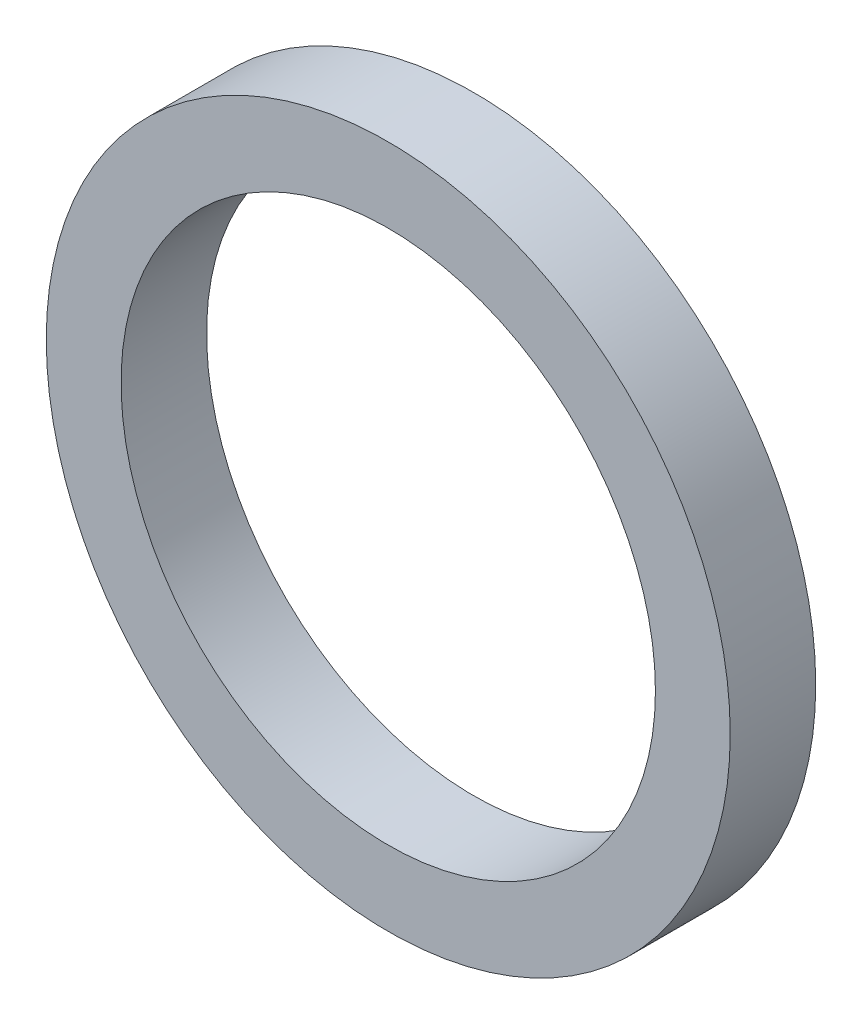
ISO-10303-21;
HEADER;
FILE_DESCRIPTION(('STEP AP214'),'2;1');
FILE_NAME('part.step','',(''),(''),'','','');
FILE_SCHEMA(('AUTOMOTIVE_DESIGN { 1 0 10303 214 1 1 1 1 }'));
ENDSEC;
DATA;
#1=APPLICATION_CONTEXT('core data for automotive mechanical design processes');
#2=APPLICATION_PROTOCOL_DEFINITION('international standard','automotive_design',2000,#1);
#3=PRODUCT_CONTEXT('',#1,'mechanical');
#4=PRODUCT('Part','Part','',(#3));
#5=PRODUCT_RELATED_PRODUCT_CATEGORY('part','',(#4));
#6=PRODUCT_DEFINITION_FORMATION('','',#4);
#7=PRODUCT_DEFINITION_CONTEXT('part definition',#1,'design');
#8=PRODUCT_DEFINITION('design','',#6,#7);
#9=PRODUCT_DEFINITION_SHAPE('','',#8);
#10=(LENGTH_UNIT() NAMED_UNIT(*) SI_UNIT(.MILLI.,.METRE.));
#11=(NAMED_UNIT(*) PLANE_ANGLE_UNIT() SI_UNIT($,.RADIAN.));
#12=(NAMED_UNIT(*) SI_UNIT($,.STERADIAN.) SOLID_ANGLE_UNIT());
#13=UNCERTAINTY_MEASURE_WITH_UNIT(LENGTH_MEASURE(1.E-05),#10,'distance_accuracy_value','');
#14=(GEOMETRIC_REPRESENTATION_CONTEXT(3) GLOBAL_UNCERTAINTY_ASSIGNED_CONTEXT((#13)) GLOBAL_UNIT_ASSIGNED_CONTEXT((#10,
#11,#12)) REPRESENTATION_CONTEXT('',''));
#15=CARTESIAN_POINT('',(0.,0.,0.));
#16=DIRECTION('',(0.,0.,1.));
#17=DIRECTION('',(1.,0.,0.));
#18=AXIS2_PLACEMENT_3D('',#15,#16,#17);
#19=CARTESIAN_POINT('',(0.,0.,4.));
#20=DIRECTION('',(0.,0.,1.));
#21=DIRECTION('',(1.,0.,0.));
#22=AXIS2_PLACEMENT_3D('',#19,#20,#21);
#23=PLANE('',#22);
#24=CARTESIAN_POINT('',(0.,0.,4.));
#25=DIRECTION('',(0.,0.,1.));
#26=DIRECTION('',(1.,0.,0.));
#27=AXIS2_PLACEMENT_3D('',#24,#25,#26);
#28=CIRCLE('',#27,16.);
#29=CARTESIAN_POINT('',(16.,0.,4.));
#30=VERTEX_POINT('',#29);
#31=EDGE_CURVE('E10',#30,#30,#28,.T.);
#32=ORIENTED_EDGE('',*,*,#31,.T.);
#33=EDGE_LOOP('',(#32));
#34=FACE_BOUND('',#33,.T.);
#35=CARTESIAN_POINT('',(0.,0.,4.));
#36=DIRECTION('',(0.,0.,1.));
#37=DIRECTION('',(1.,0.,0.));
#38=AXIS2_PLACEMENT_3D('',#35,#36,#37);
#39=CIRCLE('',#38,12.5);
#40=CARTESIAN_POINT('',(12.5,0.,4.));
#41=VERTEX_POINT('',#40);
#42=EDGE_CURVE('E50',#41,#41,#39,.T.);
#43=ORIENTED_EDGE('',*,*,#42,.F.);
#44=EDGE_LOOP('',(#43));
#45=FACE_BOUND('',#44,.T.);
#46=ADVANCED_FACE('F39',(#34,#45),#23,.T.);
#47=CARTESIAN_POINT('',(0.,0.,0.));
#48=DIRECTION('',(0.,0.,1.));
#49=DIRECTION('',(1.,0.,0.));
#50=AXIS2_PLACEMENT_3D('',#47,#48,#49);
#51=PLANE('',#50);
#52=CARTESIAN_POINT('',(0.,0.,0.));
#53=DIRECTION('',(0.,0.,1.));
#54=DIRECTION('',(1.,0.,0.));
#55=AXIS2_PLACEMENT_3D('',#52,#53,#54);
#56=CIRCLE('',#55,16.);
#57=CARTESIAN_POINT('',(16.,0.,0.));
#58=VERTEX_POINT('',#57);
#59=EDGE_CURVE('E43',#58,#58,#56,.T.);
#60=ORIENTED_EDGE('',*,*,#59,.F.);
#61=EDGE_LOOP('',(#60));
#62=FACE_BOUND('',#61,.T.);
#63=CARTESIAN_POINT('',(0.,0.,0.));
#64=DIRECTION('',(0.,0.,1.));
#65=DIRECTION('',(1.,0.,0.));
#66=AXIS2_PLACEMENT_3D('',#63,#64,#65);
#67=CIRCLE('',#66,12.5);
#68=CARTESIAN_POINT('',(12.5,0.,0.));
#69=VERTEX_POINT('',#68);
#70=EDGE_CURVE('E52',#69,#69,#67,.T.);
#71=ORIENTED_EDGE('',*,*,#70,.T.);
#72=EDGE_LOOP('',(#71));
#73=FACE_BOUND('',#72,.T.);
#74=ADVANCED_FACE('F62',(#62,#73),#51,.F.);
#75=CARTESIAN_POINT('',(0.,0.,4.));
#76=DIRECTION('',(0.,0.,-1.));
#77=DIRECTION('',(-1.,0.,0.));
#78=AXIS2_PLACEMENT_3D('',#75,#76,#77);
#79=CYLINDRICAL_SURFACE('',#78,16.);
#80=ORIENTED_EDGE('',*,*,#31,.F.);
#81=EDGE_LOOP('',(#80));
#82=FACE_BOUND('',#81,.T.);
#83=ORIENTED_EDGE('',*,*,#59,.T.);
#84=EDGE_LOOP('',(#83));
#85=FACE_BOUND('',#84,.T.);
#86=ADVANCED_FACE('F41',(#82,#85),#79,.T.);
#87=CARTESIAN_POINT('',(0.,0.,4.));
#88=DIRECTION('',(0.,0.,-1.));
#89=DIRECTION('',(-1.,0.,0.));
#90=AXIS2_PLACEMENT_3D('',#87,#88,#89);
#91=CYLINDRICAL_SURFACE('',#90,12.5);
#92=ORIENTED_EDGE('',*,*,#42,.T.);
#93=EDGE_LOOP('',(#92));
#94=FACE_BOUND('',#93,.T.);
#95=ORIENTED_EDGE('',*,*,#70,.F.);
#96=EDGE_LOOP('',(#95));
#97=FACE_BOUND('',#96,.T.);
#98=ADVANCED_FACE('F58',(#94,#97),#91,.F.);
#99=CLOSED_SHELL('',(#46,#74,#86,#98));
#100=MANIFOLD_SOLID_BREP('B2',#99);
#101=ADVANCED_BREP_SHAPE_REPRESENTATION('',(#18,#100),#14);
#102=SHAPE_DEFINITION_REPRESENTATION(#9,#101);
ENDSEC;
END-ISO-10303-21;
